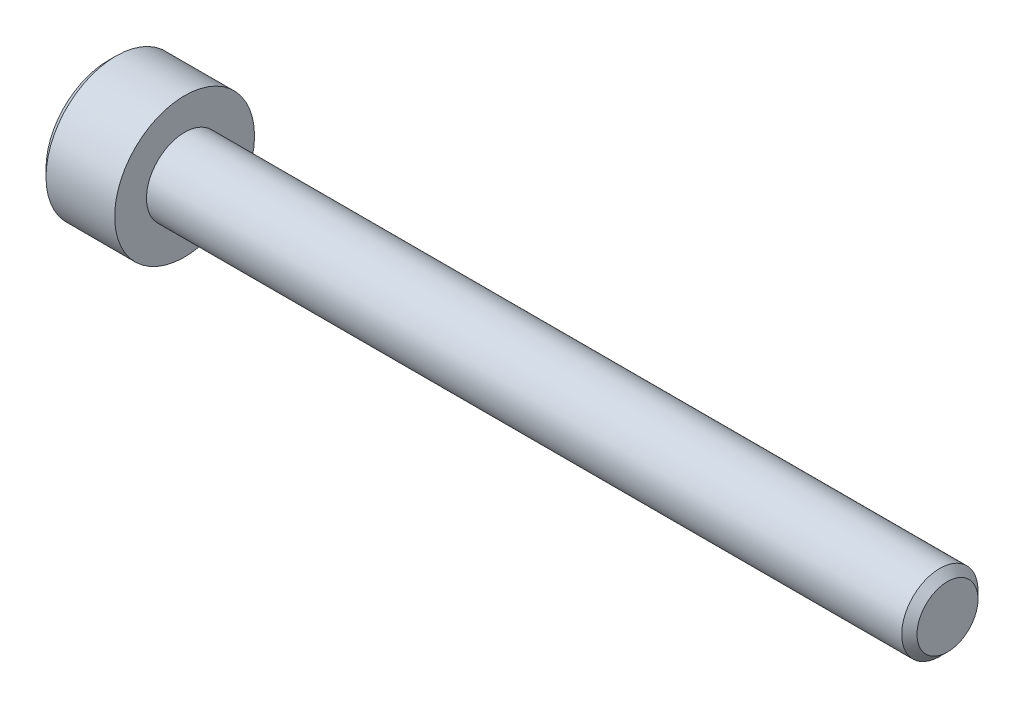
ISO-10303-21;
HEADER;
FILE_DESCRIPTION(('STEP AP214'),'2;1');
FILE_NAME('part.step','',(''),(''),'','','');
FILE_SCHEMA(('AUTOMOTIVE_DESIGN { 1 0 10303 214 1 1 1 1 }'));
ENDSEC;
DATA;
#1=APPLICATION_CONTEXT('core data for automotive mechanical design processes');
#2=APPLICATION_PROTOCOL_DEFINITION('international standard','automotive_design',2000,#1);
#3=PRODUCT_CONTEXT('',#1,'mechanical');
#4=PRODUCT('Part','Part','',(#3));
#5=PRODUCT_RELATED_PRODUCT_CATEGORY('part','',(#4));
#6=PRODUCT_DEFINITION_FORMATION('','',#4);
#7=PRODUCT_DEFINITION_CONTEXT('part definition',#1,'design');
#8=PRODUCT_DEFINITION('design','',#6,#7);
#9=PRODUCT_DEFINITION_SHAPE('','',#8);
#10=(LENGTH_UNIT() NAMED_UNIT(*) SI_UNIT(.MILLI.,.METRE.));
#11=(NAMED_UNIT(*) PLANE_ANGLE_UNIT() SI_UNIT($,.RADIAN.));
#12=(NAMED_UNIT(*) SI_UNIT($,.STERADIAN.) SOLID_ANGLE_UNIT());
#13=UNCERTAINTY_MEASURE_WITH_UNIT(LENGTH_MEASURE(1.E-05),#10,'distance_accuracy_value','');
#14=(GEOMETRIC_REPRESENTATION_CONTEXT(3) GLOBAL_UNCERTAINTY_ASSIGNED_CONTEXT((#13)) GLOBAL_UNIT_ASSIGNED_CONTEXT((#10,
#11,#12)) REPRESENTATION_CONTEXT('',''));
#15=CARTESIAN_POINT('',(0.,0.,0.));
#16=DIRECTION('',(0.,0.,1.));
#17=DIRECTION('',(1.,0.,0.));
#18=AXIS2_PLACEMENT_3D('',#15,#16,#17);
#19=CARTESIAN_POINT('',(-1.5,0.,0.));
#20=DIRECTION('',(-1.,0.,0.));
#21=DIRECTION('',(0.,0.,1.));
#22=AXIS2_PLACEMENT_3D('',#19,#20,#21);
#23=PLANE('',#22);
#24=DIRECTION('',(0.,-1.,0.));
#25=VECTOR('',#24,1.);
#26=CARTESIAN_POINT('',(-1.5,0.721687836487031,-1.25));
#27=LINE('',#26,#25);
#28=CARTESIAN_POINT('',(-1.5,0.721687836487031,-1.25));
#29=VERTEX_POINT('',#28);
#30=CARTESIAN_POINT('',(-1.50000000002341,0.,-1.25));
#31=VERTEX_POINT('',#30);
#32=EDGE_CURVE('E158',#29,#31,#27,.T.);
#33=ORIENTED_EDGE('',*,*,#32,.T.);
#34=CARTESIAN_POINT('',(-1.50000000002341,0.,0.));
#35=DIRECTION('',(1.,0.,0.));
#36=DIRECTION('',(0.,0.,-1.));
#37=AXIS2_PLACEMENT_3D('',#34,#35,#36);
#38=CIRCLE('',#37,1.24999999997044);
#39=CARTESIAN_POINT('',(-1.50000000002341,1.08253175470495,-0.624999999985219));
#40=VERTEX_POINT('',#39);
#41=EDGE_CURVE('E48',#31,#40,#38,.T.);
#42=ORIENTED_EDGE('',*,*,#41,.T.);
#43=DIRECTION('',(0.,-0.499999999999998,-0.86602540378444));
#44=VECTOR('',#43,1.);
#45=CARTESIAN_POINT('',(-1.5,1.44337567297406,0.));
#46=LINE('',#45,#44);
#47=EDGE_CURVE('E245',#40,#29,#46,.T.);
#48=ORIENTED_EDGE('',*,*,#47,.T.);
#49=EDGE_LOOP('',(#33,#42,#48));
#50=FACE_BOUND('',#49,.T.);
#51=ADVANCED_FACE('F33',(#50),#23,.T.);
#52=CARTESIAN_POINT('',(-1.5,1.44337567297406,0.));
#53=VERTEX_POINT('',#52);
#54=EDGE_CURVE('E246',#53,#40,#46,.T.);
#55=ORIENTED_EDGE('',*,*,#54,.T.);
#56=CARTESIAN_POINT('',(-1.50000000002341,1.08253175470495,0.624999999985218));
#57=VERTEX_POINT('',#56);
#58=EDGE_CURVE('E198',#40,#57,#38,.T.);
#59=ORIENTED_EDGE('',*,*,#58,.T.);
#60=DIRECTION('',(0.,0.499999999999998,-0.86602540378444));
#61=VECTOR('',#60,1.);
#62=CARTESIAN_POINT('',(-1.5,0.721687836487032,1.25));
#63=LINE('',#62,#61);
#64=EDGE_CURVE('E242',#57,#53,#63,.T.);
#65=ORIENTED_EDGE('',*,*,#64,.T.);
#66=EDGE_LOOP('',(#55,#59,#65));
#67=FACE_BOUND('',#66,.T.);
#68=ADVANCED_FACE('F121',(#67),#23,.T.);
#69=CARTESIAN_POINT('',(-1.5,0.721687836487032,1.25));
#70=VERTEX_POINT('',#69);
#71=EDGE_CURVE('E243',#70,#57,#63,.T.);
#72=ORIENTED_EDGE('',*,*,#71,.T.);
#73=CARTESIAN_POINT('',(-1.50000000002341,0.,1.24999999997044));
#74=VERTEX_POINT('',#73);
#75=EDGE_CURVE('E382',#57,#74,#38,.T.);
#76=ORIENTED_EDGE('',*,*,#75,.T.);
#77=DIRECTION('',(0.,1.,0.));
#78=VECTOR('',#77,1.);
#79=CARTESIAN_POINT('',(-1.5,-0.721687836487031,1.25));
#80=LINE('',#79,#78);
#81=EDGE_CURVE('E238',#74,#70,#80,.T.);
#82=ORIENTED_EDGE('',*,*,#81,.T.);
#83=EDGE_LOOP('',(#72,#76,#82));
#84=FACE_BOUND('',#83,.T.);
#85=ADVANCED_FACE('F127',(#84),#23,.T.);
#86=CARTESIAN_POINT('',(-1.5,-0.721687836487031,1.25));
#87=VERTEX_POINT('',#86);
#88=EDGE_CURVE('E226',#87,#74,#80,.T.);
#89=ORIENTED_EDGE('',*,*,#88,.T.);
#90=CARTESIAN_POINT('',(-1.50000000002341,-1.08253175470495,0.624999999985219));
#91=VERTEX_POINT('',#90);
#92=EDGE_CURVE('E380',#74,#91,#38,.T.);
#93=ORIENTED_EDGE('',*,*,#92,.T.);
#94=DIRECTION('',(0.,0.499999999999999,0.866025403784439));
#95=VECTOR('',#94,1.);
#96=CARTESIAN_POINT('',(-1.5,-1.44337567297406,0.));
#97=LINE('',#96,#95);
#98=EDGE_CURVE('E178',#91,#87,#97,.T.);
#99=ORIENTED_EDGE('',*,*,#98,.T.);
#100=EDGE_LOOP('',(#89,#93,#99));
#101=FACE_BOUND('',#100,.T.);
#102=ADVANCED_FACE('F142',(#101),#23,.T.);
#103=CARTESIAN_POINT('',(-1.5,-1.44337567297406,0.));
#104=VERTEX_POINT('',#103);
#105=EDGE_CURVE('E231',#104,#91,#97,.T.);
#106=ORIENTED_EDGE('',*,*,#105,.T.);
#107=CARTESIAN_POINT('',(-1.50000000002341,-1.08253175470495,-0.624999999985218));
#108=VERTEX_POINT('',#107);
#109=EDGE_CURVE('E236',#91,#108,#38,.T.);
#110=ORIENTED_EDGE('',*,*,#109,.T.);
#111=DIRECTION('',(0.,-0.499999999999998,0.86602540378444));
#112=VECTOR('',#111,1.);
#113=CARTESIAN_POINT('',(-1.5,-0.721687836487032,-1.25));
#114=LINE('',#113,#112);
#115=EDGE_CURVE('E154',#108,#104,#114,.T.);
#116=ORIENTED_EDGE('',*,*,#115,.T.);
#117=EDGE_LOOP('',(#106,#110,#116));
#118=FACE_BOUND('',#117,.T.);
#119=ADVANCED_FACE('F133',(#118),#23,.T.);
#120=CARTESIAN_POINT('',(-1.5,-0.721687836487032,-1.25));
#121=VERTEX_POINT('',#120);
#122=EDGE_CURVE('E146',#121,#108,#114,.T.);
#123=ORIENTED_EDGE('',*,*,#122,.T.);
#124=EDGE_CURVE('E147',#108,#31,#38,.T.);
#125=ORIENTED_EDGE('',*,*,#124,.T.);
#126=EDGE_CURVE('E149',#31,#121,#27,.T.);
#127=ORIENTED_EDGE('',*,*,#126,.T.);
#128=EDGE_LOOP('',(#123,#125,#127));
#129=FACE_BOUND('',#128,.T.);
#130=ADVANCED_FACE('F123',(#129),#23,.T.);
#131=CARTESIAN_POINT('',(0.,0.,0.));
#132=DIRECTION('',(1.,0.,0.));
#133=DIRECTION('',(0.,0.,-1.));
#134=AXIS2_PLACEMENT_3D('',#131,#132,#133);
#135=PLANE('',#134);
#136=CARTESIAN_POINT('',(0.,0.,0.));
#137=DIRECTION('',(1.,0.,0.));
#138=DIRECTION('',(0.,0.,-1.));
#139=AXIS2_PLACEMENT_3D('',#136,#137,#138);
#140=CIRCLE('',#139,2.75);
#141=CARTESIAN_POINT('',(0.,0.,-2.75));
#142=VERTEX_POINT('',#141);
#143=EDGE_CURVE('E191',#142,#142,#140,.T.);
#144=ORIENTED_EDGE('',*,*,#143,.T.);
#145=EDGE_LOOP('',(#144));
#146=FACE_BOUND('',#145,.T.);
#147=CARTESIAN_POINT('',(0.,0.,0.));
#148=DIRECTION('',(1.,0.,0.));
#149=DIRECTION('',(0.,0.,-1.));
#150=AXIS2_PLACEMENT_3D('',#147,#148,#149);
#151=CIRCLE('',#150,1.5);
#152=CARTESIAN_POINT('',(0.,0.,-1.5));
#153=VERTEX_POINT('',#152);
#154=EDGE_CURVE('E181',#153,#153,#151,.T.);
#155=ORIENTED_EDGE('',*,*,#154,.F.);
#156=EDGE_LOOP('',(#155));
#157=FACE_BOUND('',#156,.T.);
#158=ADVANCED_FACE('F132',(#146,#157),#135,.T.);
#159=CARTESIAN_POINT('',(-3.,0.,0.));
#160=DIRECTION('',(1.,0.,0.));
#161=DIRECTION('',(0.,0.,-1.));
#162=AXIS2_PLACEMENT_3D('',#159,#160,#161);
#163=CYLINDRICAL_SURFACE('',#162,2.75);
#164=CARTESIAN_POINT('',(-2.70000000001219,0.,0.));
#165=DIRECTION('',(-1.,0.,0.));
#166=DIRECTION('',(0.,0.,1.));
#167=AXIS2_PLACEMENT_3D('',#164,#165,#166);
#168=CIRCLE('',#167,2.75);
#169=CARTESIAN_POINT('',(-2.70000000001219,0.,2.75));
#170=VERTEX_POINT('',#169);
#171=EDGE_CURVE('E41',#170,#170,#168,.F.);
#172=ORIENTED_EDGE('',*,*,#171,.T.);
#173=EDGE_LOOP('',(#172));
#174=FACE_BOUND('',#173,.T.);
#175=ORIENTED_EDGE('',*,*,#143,.F.);
#176=EDGE_LOOP('',(#175));
#177=FACE_BOUND('',#176,.T.);
#178=ADVANCED_FACE('F139',(#174,#177),#163,.T.);
#179=CARTESIAN_POINT('',(-3.,2.75,0.));
#180=DIRECTION('',(-1.,0.,0.));
#181=DIRECTION('',(0.,0.,1.));
#182=AXIS2_PLACEMENT_3D('',#179,#180,#181);
#183=PLANE('',#182);
#184=CARTESIAN_POINT('',(-3.,0.,0.));
#185=DIRECTION('',(-1.,0.,0.));
#186=DIRECTION('',(0.,0.,1.));
#187=AXIS2_PLACEMENT_3D('',#184,#185,#186);
#188=CIRCLE('',#187,2.45000000001219);
#189=CARTESIAN_POINT('',(-3.,0.,2.45000000001219));
#190=VERTEX_POINT('',#189);
#191=EDGE_CURVE('E11',#190,#190,#188,.T.);
#192=ORIENTED_EDGE('',*,*,#191,.T.);
#193=EDGE_LOOP('',(#192));
#194=FACE_BOUND('',#193,.T.);
#195=DIRECTION('',(0.,0.499999999999999,0.866025403784439));
#196=VECTOR('',#195,1.);
#197=CARTESIAN_POINT('',(-3.,-1.44337567297406,0.));
#198=LINE('',#197,#196);
#199=CARTESIAN_POINT('',(-3.,-1.44337567297406,0.));
#200=VERTEX_POINT('',#199);
#201=CARTESIAN_POINT('',(-3.,-0.721687836487031,1.25));
#202=VERTEX_POINT('',#201);
#203=EDGE_CURVE('E56',#200,#202,#198,.T.);
#204=ORIENTED_EDGE('',*,*,#203,.F.);
#205=DIRECTION('',(0.,-0.499999999999998,0.86602540378444));
#206=VECTOR('',#205,1.);
#207=CARTESIAN_POINT('',(-3.,-0.721687836487032,-1.25));
#208=LINE('',#207,#206);
#209=CARTESIAN_POINT('',(-3.,-0.721687836487032,-1.25));
#210=VERTEX_POINT('',#209);
#211=EDGE_CURVE('E175',#210,#200,#208,.T.);
#212=ORIENTED_EDGE('',*,*,#211,.F.);
#213=DIRECTION('',(0.,-1.,0.));
#214=VECTOR('',#213,1.);
#215=CARTESIAN_POINT('',(-3.,0.721687836487031,-1.25));
#216=LINE('',#215,#214);
#217=CARTESIAN_POINT('',(-3.,0.721687836487031,-1.25));
#218=VERTEX_POINT('',#217);
#219=EDGE_CURVE('E172',#218,#210,#216,.T.);
#220=ORIENTED_EDGE('',*,*,#219,.F.);
#221=DIRECTION('',(0.,-0.499999999999998,-0.86602540378444));
#222=VECTOR('',#221,1.);
#223=CARTESIAN_POINT('',(-3.,1.44337567297406,0.));
#224=LINE('',#223,#222);
#225=CARTESIAN_POINT('',(-3.,1.44337567297406,0.));
#226=VERTEX_POINT('',#225);
#227=EDGE_CURVE('E169',#226,#218,#224,.T.);
#228=ORIENTED_EDGE('',*,*,#227,.F.);
#229=DIRECTION('',(0.,0.499999999999998,-0.86602540378444));
#230=VECTOR('',#229,1.);
#231=CARTESIAN_POINT('',(-3.,0.721687836487032,1.25));
#232=LINE('',#231,#230);
#233=CARTESIAN_POINT('',(-3.,0.721687836487032,1.25));
#234=VERTEX_POINT('',#233);
#235=EDGE_CURVE('E166',#234,#226,#232,.T.);
#236=ORIENTED_EDGE('',*,*,#235,.F.);
#237=DIRECTION('',(0.,1.,0.));
#238=VECTOR('',#237,1.);
#239=CARTESIAN_POINT('',(-3.,-0.721687836487031,1.25));
#240=LINE('',#239,#238);
#241=EDGE_CURVE('E163',#202,#234,#240,.T.);
#242=ORIENTED_EDGE('',*,*,#241,.F.);
#243=EDGE_LOOP('',(#204,#212,#220,#228,#236,#242));
#244=FACE_BOUND('',#243,.T.);
#245=ADVANCED_FACE('F211',(#194,#244),#183,.T.);
#246=CARTESIAN_POINT('',(30.,0.,0.));
#247=DIRECTION('',(-1.,0.,0.));
#248=DIRECTION('',(0.,0.,1.));
#249=AXIS2_PLACEMENT_3D('',#246,#247,#248);
#250=CYLINDRICAL_SURFACE('',#249,1.5);
#251=CARTESIAN_POINT('',(29.7000000000122,0.,0.));
#252=DIRECTION('',(1.,0.,0.));
#253=DIRECTION('',(0.,0.,-1.));
#254=AXIS2_PLACEMENT_3D('',#251,#252,#253);
#255=CIRCLE('',#254,1.5);
#256=CARTESIAN_POINT('',(29.7000000000122,0.,-1.5));
#257=VERTEX_POINT('',#256);
#258=EDGE_CURVE('E197',#257,#257,#255,.F.);
#259=ORIENTED_EDGE('',*,*,#258,.T.);
#260=EDGE_LOOP('',(#259));
#261=FACE_BOUND('',#260,.T.);
#262=ORIENTED_EDGE('',*,*,#154,.T.);
#263=EDGE_LOOP('',(#262));
#264=FACE_BOUND('',#263,.T.);
#265=ADVANCED_FACE('F214',(#261,#264),#250,.T.);
#266=CARTESIAN_POINT('',(30.,0.,0.));
#267=DIRECTION('',(1.,0.,0.));
#268=DIRECTION('',(0.,0.,-1.));
#269=AXIS2_PLACEMENT_3D('',#266,#267,#268);
#270=PLANE('',#269);
#271=CARTESIAN_POINT('',(30.,0.,0.));
#272=DIRECTION('',(1.,0.,0.));
#273=DIRECTION('',(0.,0.,-1.));
#274=AXIS2_PLACEMENT_3D('',#271,#272,#273);
#275=CIRCLE('',#274,1.20000000001218);
#276=CARTESIAN_POINT('',(30.,0.,-1.20000000001218));
#277=VERTEX_POINT('',#276);
#278=EDGE_CURVE('E194',#277,#277,#275,.T.);
#279=ORIENTED_EDGE('',*,*,#278,.T.);
#280=EDGE_LOOP('',(#279));
#281=FACE_BOUND('',#280,.T.);
#282=ADVANCED_FACE('F264',(#281),#270,.T.);
#283=CARTESIAN_POINT('',(-1.5,-1.44337567297406,0.));
#284=DIRECTION('',(0.,-0.866025403784439,0.499999999999999));
#285=DIRECTION('',(0.,-0.499999999999999,-0.866025403784439));
#286=AXIS2_PLACEMENT_3D('',#283,#284,#285);
#287=PLANE('',#286);
#288=ORIENTED_EDGE('',*,*,#203,.T.);
#289=DIRECTION('',(-1.,0.,0.));
#290=VECTOR('',#289,1.);
#291=CARTESIAN_POINT('',(-1.5,-0.721687836487031,1.25));
#292=LINE('',#291,#290);
#293=EDGE_CURVE('E153',#87,#202,#292,.T.);
#294=ORIENTED_EDGE('',*,*,#293,.F.);
#295=ORIENTED_EDGE('',*,*,#98,.F.);
#296=ORIENTED_EDGE('',*,*,#105,.F.);
#297=DIRECTION('',(-1.,0.,0.));
#298=VECTOR('',#297,1.);
#299=CARTESIAN_POINT('',(-1.5,-1.44337567297406,0.));
#300=LINE('',#299,#298);
#301=EDGE_CURVE('E179',#104,#200,#300,.T.);
#302=ORIENTED_EDGE('',*,*,#301,.T.);
#303=EDGE_LOOP('',(#288,#294,#295,#296,#302));
#304=FACE_BOUND('',#303,.T.);
#305=ADVANCED_FACE('F228',(#304),#287,.F.);
#306=CARTESIAN_POINT('',(-1.5,-0.721687836487032,-1.25));
#307=DIRECTION('',(0.,-0.86602540378444,-0.499999999999998));
#308=DIRECTION('',(0.,0.499999999999998,-0.86602540378444));
#309=AXIS2_PLACEMENT_3D('',#306,#307,#308);
#310=PLANE('',#309);
#311=ORIENTED_EDGE('',*,*,#211,.T.);
#312=ORIENTED_EDGE('',*,*,#301,.F.);
#313=ORIENTED_EDGE('',*,*,#115,.F.);
#314=ORIENTED_EDGE('',*,*,#122,.F.);
#315=DIRECTION('',(-1.,0.,0.));
#316=VECTOR('',#315,1.);
#317=CARTESIAN_POINT('',(-1.5,-0.721687836487032,-1.25));
#318=LINE('',#317,#316);
#319=EDGE_CURVE('E182',#121,#210,#318,.T.);
#320=ORIENTED_EDGE('',*,*,#319,.T.);
#321=EDGE_LOOP('',(#311,#312,#313,#314,#320));
#322=FACE_BOUND('',#321,.T.);
#323=ADVANCED_FACE('F257',(#322),#310,.F.);
#324=CARTESIAN_POINT('',(-1.5,0.721687836487031,-1.25));
#325=DIRECTION('',(0.,0.,-1.));
#326=DIRECTION('',(0.,1.,0.));
#327=AXIS2_PLACEMENT_3D('',#324,#325,#326);
#328=PLANE('',#327);
#329=ORIENTED_EDGE('',*,*,#219,.T.);
#330=ORIENTED_EDGE('',*,*,#319,.F.);
#331=ORIENTED_EDGE('',*,*,#126,.F.);
#332=ORIENTED_EDGE('',*,*,#32,.F.);
#333=DIRECTION('',(-1.,0.,0.));
#334=VECTOR('',#333,1.);
#335=CARTESIAN_POINT('',(-1.5,0.721687836487031,-1.25));
#336=LINE('',#335,#334);
#337=EDGE_CURVE('E184',#29,#218,#336,.T.);
#338=ORIENTED_EDGE('',*,*,#337,.T.);
#339=EDGE_LOOP('',(#329,#330,#331,#332,#338));
#340=FACE_BOUND('',#339,.T.);
#341=ADVANCED_FACE('F256',(#340),#328,.F.);
#342=CARTESIAN_POINT('',(-1.5,1.44337567297406,0.));
#343=DIRECTION('',(0.,0.86602540378444,-0.499999999999998));
#344=DIRECTION('',(0.,0.499999999999998,0.86602540378444));
#345=AXIS2_PLACEMENT_3D('',#342,#343,#344);
#346=PLANE('',#345);
#347=ORIENTED_EDGE('',*,*,#227,.T.);
#348=ORIENTED_EDGE('',*,*,#337,.F.);
#349=ORIENTED_EDGE('',*,*,#47,.F.);
#350=ORIENTED_EDGE('',*,*,#54,.F.);
#351=DIRECTION('',(-1.,0.,0.));
#352=VECTOR('',#351,1.);
#353=CARTESIAN_POINT('',(-1.5,1.44337567297406,0.));
#354=LINE('',#353,#352);
#355=EDGE_CURVE('E186',#53,#226,#354,.T.);
#356=ORIENTED_EDGE('',*,*,#355,.T.);
#357=EDGE_LOOP('',(#347,#348,#349,#350,#356));
#358=FACE_BOUND('',#357,.T.);
#359=ADVANCED_FACE('F254',(#358),#346,.F.);
#360=CARTESIAN_POINT('',(-1.5,0.721687836487032,1.25));
#361=DIRECTION('',(0.,0.86602540378444,0.499999999999998));
#362=DIRECTION('',(0.,-0.499999999999998,0.86602540378444));
#363=AXIS2_PLACEMENT_3D('',#360,#361,#362);
#364=PLANE('',#363);
#365=ORIENTED_EDGE('',*,*,#235,.T.);
#366=ORIENTED_EDGE('',*,*,#355,.F.);
#367=ORIENTED_EDGE('',*,*,#64,.F.);
#368=ORIENTED_EDGE('',*,*,#71,.F.);
#369=DIRECTION('',(-1.,0.,0.));
#370=VECTOR('',#369,1.);
#371=CARTESIAN_POINT('',(-1.5,0.721687836487032,1.25));
#372=LINE('',#371,#370);
#373=EDGE_CURVE('E156',#70,#234,#372,.T.);
#374=ORIENTED_EDGE('',*,*,#373,.T.);
#375=EDGE_LOOP('',(#365,#366,#367,#368,#374));
#376=FACE_BOUND('',#375,.T.);
#377=ADVANCED_FACE('F116',(#376),#364,.F.);
#378=CARTESIAN_POINT('',(-1.5,-0.721687836487031,1.25));
#379=DIRECTION('',(0.,0.,1.));
#380=DIRECTION('',(1.,0.,0.));
#381=AXIS2_PLACEMENT_3D('',#378,#379,#380);
#382=PLANE('',#381);
#383=ORIENTED_EDGE('',*,*,#241,.T.);
#384=ORIENTED_EDGE('',*,*,#373,.F.);
#385=ORIENTED_EDGE('',*,*,#81,.F.);
#386=ORIENTED_EDGE('',*,*,#88,.F.);
#387=ORIENTED_EDGE('',*,*,#293,.T.);
#388=EDGE_LOOP('',(#383,#384,#385,#386,#387));
#389=FACE_BOUND('',#388,.T.);
#390=ADVANCED_FACE('F109',(#389),#382,.F.);
#391=CARTESIAN_POINT('',(-1.16506350937176,0.,0.));
#392=DIRECTION('',(-1.,0.,0.));
#393=DIRECTION('',(0.,0.,1.));
#394=AXIS2_PLACEMENT_3D('',#391,#392,#393);
#395=CONICAL_SURFACE('',#394,0.,1.30899693890568);
#396=ORIENTED_EDGE('',*,*,#41,.F.);
#397=ORIENTED_EDGE('',*,*,#124,.F.);
#398=ORIENTED_EDGE('',*,*,#109,.F.);
#399=ORIENTED_EDGE('',*,*,#92,.F.);
#400=ORIENTED_EDGE('',*,*,#75,.F.);
#401=ORIENTED_EDGE('',*,*,#58,.F.);
#402=EDGE_LOOP('',(#396,#397,#398,#399,#400,#401));
#403=FACE_BOUND('',#402,.T.);
#404=CARTESIAN_POINT('',(-1.16506350937176,0.,0.));
#405=VERTEX_POINT('',#404);
#406=VERTEX_LOOP('',#405);
#407=FACE_BOUND('',#406,.T.);
#408=ADVANCED_FACE('F106',(#403,#407),#395,.F.);
#409=CARTESIAN_POINT('',(30.,0.,0.));
#410=DIRECTION('',(-1.,0.,0.));
#411=DIRECTION('',(0.,0.,1.));
#412=AXIS2_PLACEMENT_3D('',#409,#410,#411);
#413=CONICAL_SURFACE('',#412,1.20000000001218,0.785398163397446);
#414=ORIENTED_EDGE('',*,*,#258,.F.);
#415=EDGE_LOOP('',(#414));
#416=FACE_BOUND('',#415,.T.);
#417=ORIENTED_EDGE('',*,*,#278,.F.);
#418=EDGE_LOOP('',(#417));
#419=FACE_BOUND('',#418,.T.);
#420=ADVANCED_FACE('F108',(#416,#419),#413,.T.);
#421=CARTESIAN_POINT('',(-2.70000000001219,0.,0.));
#422=DIRECTION('',(1.,0.,0.));
#423=DIRECTION('',(0.,0.,-1.));
#424=AXIS2_PLACEMENT_3D('',#421,#422,#423);
#425=CONICAL_SURFACE('',#424,2.75,0.78539816339745);
#426=ORIENTED_EDGE('',*,*,#191,.F.);
#427=EDGE_LOOP('',(#426));
#428=FACE_BOUND('',#427,.T.);
#429=ORIENTED_EDGE('',*,*,#171,.F.);
#430=EDGE_LOOP('',(#429));
#431=FACE_BOUND('',#430,.T.);
#432=ADVANCED_FACE('F35',(#428,#431),#425,.T.);
#433=CLOSED_SHELL('',(#51,#68,#85,#102,#119,#130,#158,#178,#245,#265,#282,#305,#323,#341,#359,
#377,#390,#408,#420,#432));
#434=MANIFOLD_SOLID_BREP('B2',#433);
#435=ADVANCED_BREP_SHAPE_REPRESENTATION('',(#18,#434),#14);
#436=SHAPE_DEFINITION_REPRESENTATION(#9,#435);
ENDSEC;
END-ISO-10303-21;
